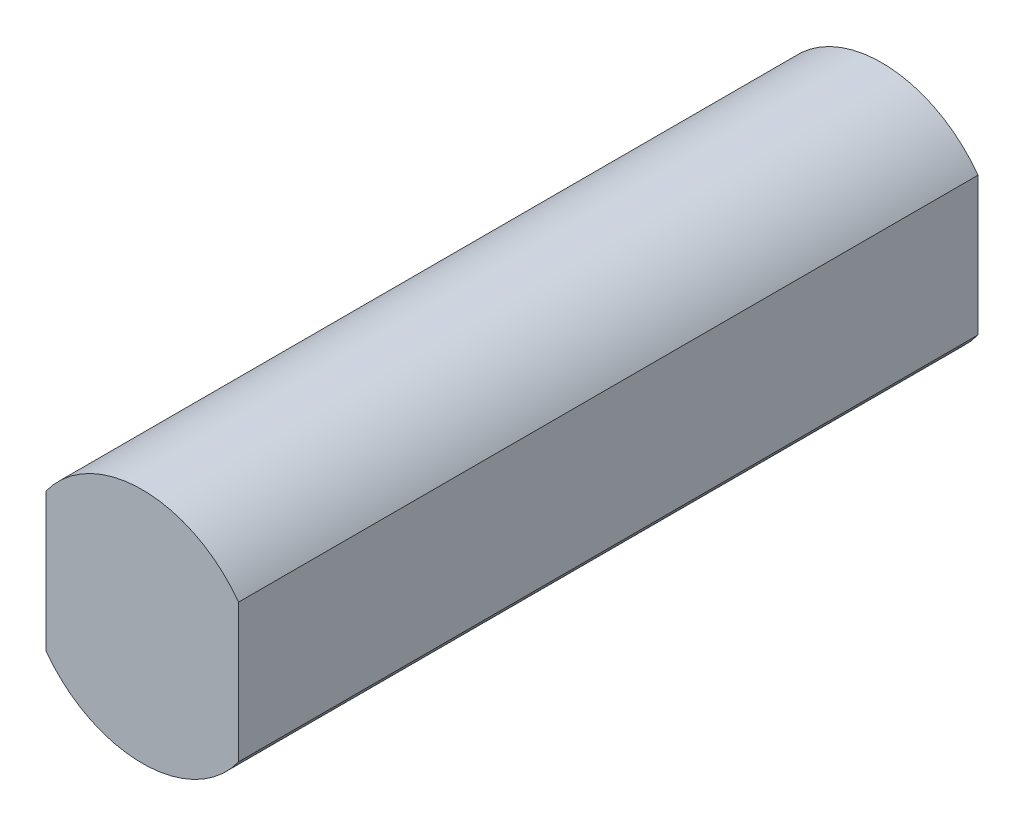
ISO-10303-21;
HEADER;
FILE_DESCRIPTION(('STEP AP214'),'2;1');
FILE_NAME('part.step','',(''),(''),'','','');
FILE_SCHEMA(('AUTOMOTIVE_DESIGN { 1 0 10303 214 1 1 1 1 }'));
ENDSEC;
DATA;
#1=APPLICATION_CONTEXT('core data for automotive mechanical design processes');
#2=APPLICATION_PROTOCOL_DEFINITION('international standard','automotive_design',2000,#1);
#3=PRODUCT_CONTEXT('',#1,'mechanical');
#4=PRODUCT('Part','Part','',(#3));
#5=PRODUCT_RELATED_PRODUCT_CATEGORY('part','',(#4));
#6=PRODUCT_DEFINITION_FORMATION('','',#4);
#7=PRODUCT_DEFINITION_CONTEXT('part definition',#1,'design');
#8=PRODUCT_DEFINITION('design','',#6,#7);
#9=PRODUCT_DEFINITION_SHAPE('','',#8);
#10=(LENGTH_UNIT() NAMED_UNIT(*) SI_UNIT(.MILLI.,.METRE.));
#11=(NAMED_UNIT(*) PLANE_ANGLE_UNIT() SI_UNIT($,.RADIAN.));
#12=(NAMED_UNIT(*) SI_UNIT($,.STERADIAN.) SOLID_ANGLE_UNIT());
#13=UNCERTAINTY_MEASURE_WITH_UNIT(LENGTH_MEASURE(1.E-05),#10,'distance_accuracy_value','');
#14=(GEOMETRIC_REPRESENTATION_CONTEXT(3) GLOBAL_UNCERTAINTY_ASSIGNED_CONTEXT((#13)) GLOBAL_UNIT_ASSIGNED_CONTEXT((#10,
#11,#12)) REPRESENTATION_CONTEXT('',''));
#15=CARTESIAN_POINT('',(0.,0.,0.));
#16=DIRECTION('',(0.,0.,1.));
#17=DIRECTION('',(1.,0.,0.));
#18=AXIS2_PLACEMENT_3D('',#15,#16,#17);
#19=CARTESIAN_POINT('',(-10.1599999999998,0.,110.309034392364));
#20=DIRECTION('',(1.,0.,0.));
#21=DIRECTION('',(0.,1.,0.));
#22=AXIS2_PLACEMENT_3D('',#19,#20,#21);
#23=PLANE('',#22);
#24=DIRECTION('',(0.,-1.,0.));
#25=VECTOR('',#24,1.);
#26=CARTESIAN_POINT('',(-10.1599999999998,0.,78.0709350726982));
#27=LINE('',#26,#25);
#28=CARTESIAN_POINT('',(-10.1599999999998,7.30250000000015,78.0709350726982));
#29=VERTEX_POINT('',#28);
#30=CARTESIAN_POINT('',(-10.1599999999998,-7.30249999999985,78.0709350726982));
#31=VERTEX_POINT('',#30);
#32=EDGE_CURVE('E91',#29,#31,#27,.T.);
#33=ORIENTED_EDGE('',*,*,#32,.F.);
#34=DIRECTION('',(0.,0.,-1.));
#35=VECTOR('',#34,1.);
#36=CARTESIAN_POINT('',(-10.1599999999998,7.30250000000015,110.309034392364));
#37=LINE('',#36,#35);
#38=CARTESIAN_POINT('',(-10.1599999999998,7.30250000000015,0.));
#39=VERTEX_POINT('',#38);
#40=EDGE_CURVE('E45',#29,#39,#37,.T.);
#41=ORIENTED_EDGE('',*,*,#40,.T.);
#42=DIRECTION('',(0.,-1.,0.));
#43=VECTOR('',#42,1.);
#44=CARTESIAN_POINT('',(-10.1599999999998,0.,0.));
#45=LINE('',#44,#43);
#46=CARTESIAN_POINT('',(-10.1599999999998,-7.30249999999985,0.));
#47=VERTEX_POINT('',#46);
#48=EDGE_CURVE('E89',#39,#47,#45,.T.);
#49=ORIENTED_EDGE('',*,*,#48,.T.);
#50=DIRECTION('',(0.,0.,-1.));
#51=VECTOR('',#50,1.);
#52=CARTESIAN_POINT('',(-10.1599999999998,-7.30249999999985,110.309034392364));
#53=LINE('',#52,#51);
#54=EDGE_CURVE('E80',#31,#47,#53,.T.);
#55=ORIENTED_EDGE('',*,*,#54,.F.);
#56=EDGE_LOOP('',(#33,#41,#49,#55));
#57=FACE_BOUND('',#56,.T.);
#58=ADVANCED_FACE('F41',(#57),#23,.F.);
#59=CARTESIAN_POINT('',(1.58482385238975E-13,-0.00441872818600833,110.309034392364));
#60=DIRECTION('',(0.,0.,-1.));
#61=DIRECTION('',(-1.,0.,0.));
#62=AXIS2_PLACEMENT_3D('',#59,#60,#61);
#63=CYLINDRICAL_SURFACE('',#62,12.5095);
#64=CARTESIAN_POINT('',(1.58482385238975E-13,-0.00441872818600833,78.0709350726982));
#65=DIRECTION('',(0.,0.,1.));
#66=DIRECTION('',(0.,-1.,0.));
#67=AXIS2_PLACEMENT_3D('',#64,#65,#66);
#68=CIRCLE('',#67,12.5095);
#69=CARTESIAN_POINT('',(10.1600000000002,-7.30249999999985,78.0709350726982));
#70=VERTEX_POINT('',#69);
#71=EDGE_CURVE('E50',#31,#70,#68,.T.);
#72=ORIENTED_EDGE('',*,*,#71,.F.);
#73=ORIENTED_EDGE('',*,*,#54,.T.);
#74=CARTESIAN_POINT('',(1.58482385238975E-13,-0.00441872818600833,0.));
#75=DIRECTION('',(0.,0.,1.));
#76=DIRECTION('',(1.,0.,0.));
#77=AXIS2_PLACEMENT_3D('',#74,#75,#76);
#78=CIRCLE('',#77,12.5095);
#79=CARTESIAN_POINT('',(10.1600000000002,-7.30249999999985,0.));
#80=VERTEX_POINT('',#79);
#81=EDGE_CURVE('E101',#47,#80,#78,.T.);
#82=ORIENTED_EDGE('',*,*,#81,.T.);
#83=DIRECTION('',(0.,0.,-1.));
#84=VECTOR('',#83,1.);
#85=CARTESIAN_POINT('',(10.1600000000002,-7.30249999999985,110.309034392364));
#86=LINE('',#85,#84);
#87=EDGE_CURVE('E110',#70,#80,#86,.T.);
#88=ORIENTED_EDGE('',*,*,#87,.F.);
#89=EDGE_LOOP('',(#72,#73,#82,#88));
#90=FACE_BOUND('',#89,.T.);
#91=ADVANCED_FACE('F114',(#90),#63,.T.);
#92=CARTESIAN_POINT('',(10.1600000000002,0.,110.309034392364));
#93=DIRECTION('',(-1.,0.,0.));
#94=DIRECTION('',(0.,0.,1.));
#95=AXIS2_PLACEMENT_3D('',#92,#93,#94);
#96=PLANE('',#95);
#97=DIRECTION('',(0.,1.,0.));
#98=VECTOR('',#97,1.);
#99=CARTESIAN_POINT('',(10.1600000000002,0.,78.0709350726982));
#100=LINE('',#99,#98);
#101=CARTESIAN_POINT('',(10.1600000000002,7.30250000000014,78.0709350726982));
#102=VERTEX_POINT('',#101);
#103=EDGE_CURVE('E11',#70,#102,#100,.T.);
#104=ORIENTED_EDGE('',*,*,#103,.F.);
#105=ORIENTED_EDGE('',*,*,#87,.T.);
#106=DIRECTION('',(0.,1.,0.));
#107=VECTOR('',#106,1.);
#108=CARTESIAN_POINT('',(10.1600000000002,0.,0.));
#109=LINE('',#108,#107);
#110=CARTESIAN_POINT('',(10.1600000000002,7.30250000000014,0.));
#111=VERTEX_POINT('',#110);
#112=EDGE_CURVE('E111',#80,#111,#109,.T.);
#113=ORIENTED_EDGE('',*,*,#112,.T.);
#114=DIRECTION('',(0.,0.,-1.));
#115=VECTOR('',#114,1.);
#116=CARTESIAN_POINT('',(10.1600000000002,7.30250000000014,110.309034392364));
#117=LINE('',#116,#115);
#118=EDGE_CURVE('E63',#102,#111,#117,.T.);
#119=ORIENTED_EDGE('',*,*,#118,.F.);
#120=EDGE_LOOP('',(#104,#105,#113,#119));
#121=FACE_BOUND('',#120,.T.);
#122=ADVANCED_FACE('F113',(#121),#96,.F.);
#123=CARTESIAN_POINT('',(1.58482262594631E-13,0.00441872818629906,110.309034392364));
#124=DIRECTION('',(0.,0.,-1.));
#125=DIRECTION('',(-1.,0.,0.));
#126=AXIS2_PLACEMENT_3D('',#123,#124,#125);
#127=CYLINDRICAL_SURFACE('',#126,12.5095);
#128=CARTESIAN_POINT('',(1.58482262594631E-13,0.00441872818629906,78.0709350726982));
#129=DIRECTION('',(0.,0.,1.));
#130=DIRECTION('',(0.,-1.,0.));
#131=AXIS2_PLACEMENT_3D('',#128,#129,#130);
#132=CIRCLE('',#131,12.5095);
#133=EDGE_CURVE('E98',#102,#29,#132,.T.);
#134=ORIENTED_EDGE('',*,*,#133,.F.);
#135=ORIENTED_EDGE('',*,*,#118,.T.);
#136=CARTESIAN_POINT('',(1.58482262594631E-13,0.00441872818629906,0.));
#137=DIRECTION('',(0.,0.,1.));
#138=DIRECTION('',(1.,0.,0.));
#139=AXIS2_PLACEMENT_3D('',#136,#137,#138);
#140=CIRCLE('',#139,12.5095);
#141=EDGE_CURVE('E94',#111,#39,#140,.T.);
#142=ORIENTED_EDGE('',*,*,#141,.T.);
#143=ORIENTED_EDGE('',*,*,#40,.F.);
#144=EDGE_LOOP('',(#134,#135,#142,#143));
#145=FACE_BOUND('',#144,.T.);
#146=ADVANCED_FACE('F95',(#145),#127,.T.);
#147=CARTESIAN_POINT('',(0.,0.,0.));
#148=DIRECTION('',(0.,0.,1.));
#149=DIRECTION('',(1.,0.,0.));
#150=AXIS2_PLACEMENT_3D('',#147,#148,#149);
#151=PLANE('',#150);
#152=ORIENTED_EDGE('',*,*,#48,.F.);
#153=ORIENTED_EDGE('',*,*,#141,.F.);
#154=ORIENTED_EDGE('',*,*,#112,.F.);
#155=ORIENTED_EDGE('',*,*,#81,.F.);
#156=EDGE_LOOP('',(#152,#153,#154,#155));
#157=FACE_BOUND('',#156,.T.);
#158=ADVANCED_FACE('F100',(#157),#151,.F.);
#159=CARTESIAN_POINT('',(1.1428471652943E-13,0.0033508701968929,78.0709350726982));
#160=DIRECTION('',(0.,0.,1.));
#161=DIRECTION('',(1.,0.,0.));
#162=AXIS2_PLACEMENT_3D('',#159,#160,#161);
#163=PLANE('',#162);
#164=ORIENTED_EDGE('',*,*,#133,.T.);
#165=ORIENTED_EDGE('',*,*,#32,.T.);
#166=ORIENTED_EDGE('',*,*,#71,.T.);
#167=ORIENTED_EDGE('',*,*,#103,.T.);
#168=EDGE_LOOP('',(#164,#165,#166,#167));
#169=FACE_BOUND('',#168,.T.);
#170=ADVANCED_FACE('F43',(#169),#163,.T.);
#171=CLOSED_SHELL('',(#58,#91,#122,#146,#158,#170));
#172=MANIFOLD_SOLID_BREP('B2',#171);
#173=ADVANCED_BREP_SHAPE_REPRESENTATION('',(#18,#172),#14);
#174=SHAPE_DEFINITION_REPRESENTATION(#9,#173);
ENDSEC;
END-ISO-10303-21;
